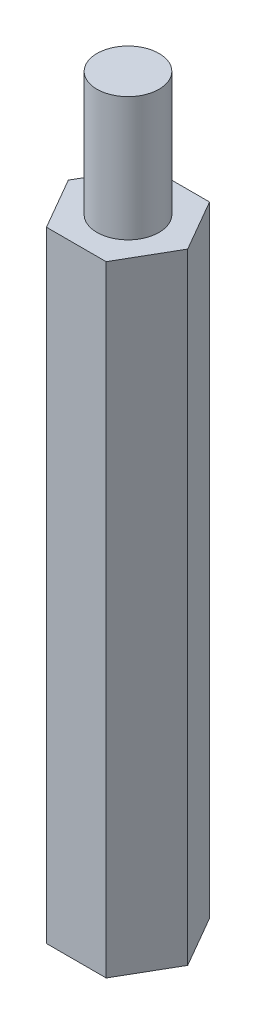
ISO-10303-21;
HEADER;
FILE_DESCRIPTION(('STEP AP214'),'2;1');
FILE_NAME('part.step','',(''),(''),'','','');
FILE_SCHEMA(('AUTOMOTIVE_DESIGN { 1 0 10303 214 1 1 1 1 }'));
ENDSEC;
DATA;
#1=APPLICATION_CONTEXT('core data for automotive mechanical design processes');
#2=APPLICATION_PROTOCOL_DEFINITION('international standard','automotive_design',2000,#1);
#3=PRODUCT_CONTEXT('',#1,'mechanical');
#4=PRODUCT('Part','Part','',(#3));
#5=PRODUCT_RELATED_PRODUCT_CATEGORY('part','',(#4));
#6=PRODUCT_DEFINITION_FORMATION('','',#4);
#7=PRODUCT_DEFINITION_CONTEXT('part definition',#1,'design');
#8=PRODUCT_DEFINITION('design','',#6,#7);
#9=PRODUCT_DEFINITION_SHAPE('','',#8);
#10=(LENGTH_UNIT() NAMED_UNIT(*) SI_UNIT(.MILLI.,.METRE.));
#11=(NAMED_UNIT(*) PLANE_ANGLE_UNIT() SI_UNIT($,.RADIAN.));
#12=(NAMED_UNIT(*) SI_UNIT($,.STERADIAN.) SOLID_ANGLE_UNIT());
#13=UNCERTAINTY_MEASURE_WITH_UNIT(LENGTH_MEASURE(1.E-05),#10,'distance_accuracy_value','');
#14=(GEOMETRIC_REPRESENTATION_CONTEXT(3) GLOBAL_UNCERTAINTY_ASSIGNED_CONTEXT((#13)) GLOBAL_UNIT_ASSIGNED_CONTEXT((#10,
#11,#12)) REPRESENTATION_CONTEXT('',''));
#15=CARTESIAN_POINT('',(0.,0.,0.));
#16=DIRECTION('',(0.,0.,1.));
#17=DIRECTION('',(1.,0.,0.));
#18=AXIS2_PLACEMENT_3D('',#15,#16,#17);
#19=CARTESIAN_POINT('',(1.44337567297406,15.,2.5));
#20=DIRECTION('',(-0.866025403784439,0.,-0.5));
#21=DIRECTION('',(-0.5,0.,0.866025403784439));
#22=AXIS2_PLACEMENT_3D('',#19,#20,#21);
#23=PLANE('',#22);
#24=DIRECTION('',(0.5,0.,-0.866025403784439));
#25=VECTOR('',#24,1.);
#26=CARTESIAN_POINT('',(1.44337567297406,-15.,2.5));
#27=LINE('',#26,#25);
#28=CARTESIAN_POINT('',(1.44337567297406,-15.,2.5));
#29=VERTEX_POINT('',#28);
#30=CARTESIAN_POINT('',(2.88675134594813,-15.,0.));
#31=VERTEX_POINT('',#30);
#32=EDGE_CURVE('E103',#29,#31,#27,.T.);
#33=ORIENTED_EDGE('',*,*,#32,.T.);
#34=DIRECTION('',(0.,-1.,0.));
#35=VECTOR('',#34,1.);
#36=CARTESIAN_POINT('',(2.88675134594813,15.,0.));
#37=LINE('',#36,#35);
#38=CARTESIAN_POINT('',(2.88675134594813,15.,0.));
#39=VERTEX_POINT('',#38);
#40=EDGE_CURVE('E20',#39,#31,#37,.T.);
#41=ORIENTED_EDGE('',*,*,#40,.F.);
#42=DIRECTION('',(0.5,0.,-0.866025403784439));
#43=VECTOR('',#42,1.);
#44=CARTESIAN_POINT('',(1.44337567297406,15.,2.5));
#45=LINE('',#44,#43);
#46=CARTESIAN_POINT('',(1.44337567297406,15.,2.5));
#47=VERTEX_POINT('',#46);
#48=EDGE_CURVE('E114',#47,#39,#45,.T.);
#49=ORIENTED_EDGE('',*,*,#48,.F.);
#50=DIRECTION('',(0.,-1.,0.));
#51=VECTOR('',#50,1.);
#52=CARTESIAN_POINT('',(1.44337567297406,15.,2.5));
#53=LINE('',#52,#51);
#54=EDGE_CURVE('E99',#47,#29,#53,.T.);
#55=ORIENTED_EDGE('',*,*,#54,.T.);
#56=EDGE_LOOP('',(#33,#41,#49,#55));
#57=FACE_BOUND('',#56,.T.);
#58=ADVANCED_FACE('F17',(#57),#23,.F.);
#59=CARTESIAN_POINT('',(2.88675134594813,15.,0.));
#60=DIRECTION('',(-0.866025403784439,0.,0.5));
#61=DIRECTION('',(0.5,0.,0.866025403784439));
#62=AXIS2_PLACEMENT_3D('',#59,#60,#61);
#63=PLANE('',#62);
#64=DIRECTION('',(-0.5,0.,-0.866025403784439));
#65=VECTOR('',#64,1.);
#66=CARTESIAN_POINT('',(2.88675134594813,-15.,0.));
#67=LINE('',#66,#65);
#68=CARTESIAN_POINT('',(1.44337567297406,-15.,-2.5));
#69=VERTEX_POINT('',#68);
#70=EDGE_CURVE('E106',#31,#69,#67,.T.);
#71=ORIENTED_EDGE('',*,*,#70,.T.);
#72=DIRECTION('',(0.,-1.,0.));
#73=VECTOR('',#72,1.);
#74=CARTESIAN_POINT('',(1.44337567297406,15.,-2.5));
#75=LINE('',#74,#73);
#76=CARTESIAN_POINT('',(1.44337567297406,15.,-2.5));
#77=VERTEX_POINT('',#76);
#78=EDGE_CURVE('E117',#77,#69,#75,.T.);
#79=ORIENTED_EDGE('',*,*,#78,.F.);
#80=DIRECTION('',(-0.5,0.,-0.866025403784439));
#81=VECTOR('',#80,1.);
#82=CARTESIAN_POINT('',(2.88675134594813,15.,0.));
#83=LINE('',#82,#81);
#84=EDGE_CURVE('E72',#39,#77,#83,.T.);
#85=ORIENTED_EDGE('',*,*,#84,.F.);
#86=ORIENTED_EDGE('',*,*,#40,.T.);
#87=EDGE_LOOP('',(#71,#79,#85,#86));
#88=FACE_BOUND('',#87,.T.);
#89=ADVANCED_FACE('F122',(#88),#63,.F.);
#90=CARTESIAN_POINT('',(1.44337567297406,15.,-2.5));
#91=DIRECTION('',(0.,0.,1.));
#92=DIRECTION('',(1.,0.,0.));
#93=AXIS2_PLACEMENT_3D('',#90,#91,#92);
#94=PLANE('',#93);
#95=DIRECTION('',(-1.,0.,0.));
#96=VECTOR('',#95,1.);
#97=CARTESIAN_POINT('',(1.44337567297406,-15.,-2.5));
#98=LINE('',#97,#96);
#99=CARTESIAN_POINT('',(-1.44337567297406,-15.,-2.5));
#100=VERTEX_POINT('',#99);
#101=EDGE_CURVE('E109',#69,#100,#98,.T.);
#102=ORIENTED_EDGE('',*,*,#101,.T.);
#103=DIRECTION('',(0.,-1.,0.));
#104=VECTOR('',#103,1.);
#105=CARTESIAN_POINT('',(-1.44337567297406,15.,-2.5));
#106=LINE('',#105,#104);
#107=CARTESIAN_POINT('',(-1.44337567297406,15.,-2.5));
#108=VERTEX_POINT('',#107);
#109=EDGE_CURVE('E94',#108,#100,#106,.T.);
#110=ORIENTED_EDGE('',*,*,#109,.F.);
#111=DIRECTION('',(-1.,0.,0.));
#112=VECTOR('',#111,1.);
#113=CARTESIAN_POINT('',(1.44337567297406,15.,-2.5));
#114=LINE('',#113,#112);
#115=EDGE_CURVE('E85',#77,#108,#114,.T.);
#116=ORIENTED_EDGE('',*,*,#115,.F.);
#117=ORIENTED_EDGE('',*,*,#78,.T.);
#118=EDGE_LOOP('',(#102,#110,#116,#117));
#119=FACE_BOUND('',#118,.T.);
#120=ADVANCED_FACE('F128',(#119),#94,.F.);
#121=CARTESIAN_POINT('',(-1.44337567297406,15.,-2.5));
#122=DIRECTION('',(0.866025403784438,0.,0.5));
#123=DIRECTION('',(0.5,0.,-0.866025403784439));
#124=AXIS2_PLACEMENT_3D('',#121,#122,#123);
#125=PLANE('',#124);
#126=DIRECTION('',(-0.5,0.,0.866025403784439));
#127=VECTOR('',#126,1.);
#128=CARTESIAN_POINT('',(-1.44337567297406,-15.,-2.5));
#129=LINE('',#128,#127);
#130=CARTESIAN_POINT('',(-2.88675134594813,-15.,0.));
#131=VERTEX_POINT('',#130);
#132=EDGE_CURVE('E93',#100,#131,#129,.T.);
#133=ORIENTED_EDGE('',*,*,#132,.T.);
#134=DIRECTION('',(0.,-1.,0.));
#135=VECTOR('',#134,1.);
#136=CARTESIAN_POINT('',(-2.88675134594813,15.,0.));
#137=LINE('',#136,#135);
#138=CARTESIAN_POINT('',(-2.88675134594813,15.,0.));
#139=VERTEX_POINT('',#138);
#140=EDGE_CURVE('E90',#139,#131,#137,.T.);
#141=ORIENTED_EDGE('',*,*,#140,.F.);
#142=DIRECTION('',(-0.5,0.,0.866025403784439));
#143=VECTOR('',#142,1.);
#144=CARTESIAN_POINT('',(-1.44337567297406,15.,-2.5));
#145=LINE('',#144,#143);
#146=EDGE_CURVE('E79',#108,#139,#145,.T.);
#147=ORIENTED_EDGE('',*,*,#146,.F.);
#148=ORIENTED_EDGE('',*,*,#109,.T.);
#149=EDGE_LOOP('',(#133,#141,#147,#148));
#150=FACE_BOUND('',#149,.T.);
#151=ADVANCED_FACE('F91',(#150),#125,.F.);
#152=CARTESIAN_POINT('',(-2.88675134594813,15.,0.));
#153=DIRECTION('',(0.866025403784439,0.,-0.5));
#154=DIRECTION('',(-0.5,0.,-0.866025403784439));
#155=AXIS2_PLACEMENT_3D('',#152,#153,#154);
#156=PLANE('',#155);
#157=DIRECTION('',(0.5,0.,0.866025403784439));
#158=VECTOR('',#157,1.);
#159=CARTESIAN_POINT('',(-2.88675134594813,-15.,0.));
#160=LINE('',#159,#158);
#161=CARTESIAN_POINT('',(-1.44337567297406,-15.,2.5));
#162=VERTEX_POINT('',#161);
#163=EDGE_CURVE('E57',#131,#162,#160,.T.);
#164=ORIENTED_EDGE('',*,*,#163,.T.);
#165=DIRECTION('',(0.,-1.,0.));
#166=VECTOR('',#165,1.);
#167=CARTESIAN_POINT('',(-1.44337567297406,15.,2.5));
#168=LINE('',#167,#166);
#169=CARTESIAN_POINT('',(-1.44337567297406,15.,2.5));
#170=VERTEX_POINT('',#169);
#171=EDGE_CURVE('E95',#170,#162,#168,.T.);
#172=ORIENTED_EDGE('',*,*,#171,.F.);
#173=DIRECTION('',(0.5,0.,0.866025403784439));
#174=VECTOR('',#173,1.);
#175=CARTESIAN_POINT('',(-2.88675134594813,15.,0.));
#176=LINE('',#175,#174);
#177=EDGE_CURVE('E83',#139,#170,#176,.T.);
#178=ORIENTED_EDGE('',*,*,#177,.F.);
#179=ORIENTED_EDGE('',*,*,#140,.T.);
#180=EDGE_LOOP('',(#164,#172,#178,#179));
#181=FACE_BOUND('',#180,.T.);
#182=ADVANCED_FACE('F97',(#181),#156,.F.);
#183=CARTESIAN_POINT('',(-1.44337567297406,15.,2.5));
#184=DIRECTION('',(0.,0.,-1.));
#185=DIRECTION('',(-1.,0.,0.));
#186=AXIS2_PLACEMENT_3D('',#183,#184,#185);
#187=PLANE('',#186);
#188=DIRECTION('',(1.,0.,0.));
#189=VECTOR('',#188,1.);
#190=CARTESIAN_POINT('',(-1.44337567297406,-15.,2.5));
#191=LINE('',#190,#189);
#192=EDGE_CURVE('E63',#162,#29,#191,.T.);
#193=ORIENTED_EDGE('',*,*,#192,.T.);
#194=ORIENTED_EDGE('',*,*,#54,.F.);
#195=DIRECTION('',(1.,0.,0.));
#196=VECTOR('',#195,1.);
#197=CARTESIAN_POINT('',(-1.44337567297406,15.,2.5));
#198=LINE('',#197,#196);
#199=EDGE_CURVE('E34',#170,#47,#198,.T.);
#200=ORIENTED_EDGE('',*,*,#199,.F.);
#201=ORIENTED_EDGE('',*,*,#171,.T.);
#202=EDGE_LOOP('',(#193,#194,#200,#201));
#203=FACE_BOUND('',#202,.T.);
#204=ADVANCED_FACE('F151',(#203),#187,.F.);
#205=CARTESIAN_POINT('',(0.,15.,0.));
#206=DIRECTION('',(0.,1.,0.));
#207=DIRECTION('',(0.,0.,1.));
#208=AXIS2_PLACEMENT_3D('',#205,#206,#207);
#209=PLANE('',#208);
#210=CARTESIAN_POINT('',(0.,15.,0.));
#211=DIRECTION('',(0.,1.,0.));
#212=DIRECTION('',(0.,0.,1.));
#213=AXIS2_PLACEMENT_3D('',#210,#211,#212);
#214=CIRCLE('',#213,1.5);
#215=CARTESIAN_POINT('',(0.,15.,1.5));
#216=VERTEX_POINT('',#215);
#217=EDGE_CURVE('E11',#216,#216,#214,.T.);
#218=ORIENTED_EDGE('',*,*,#217,.F.);
#219=EDGE_LOOP('',(#218));
#220=FACE_BOUND('',#219,.T.);
#221=ORIENTED_EDGE('',*,*,#48,.T.);
#222=ORIENTED_EDGE('',*,*,#84,.T.);
#223=ORIENTED_EDGE('',*,*,#115,.T.);
#224=ORIENTED_EDGE('',*,*,#146,.T.);
#225=ORIENTED_EDGE('',*,*,#177,.T.);
#226=ORIENTED_EDGE('',*,*,#199,.T.);
#227=EDGE_LOOP('',(#221,#222,#223,#224,#225,#226));
#228=FACE_BOUND('',#227,.T.);
#229=ADVANCED_FACE('F81',(#220,#228),#209,.T.);
#230=CARTESIAN_POINT('',(0.,-15.,0.));
#231=DIRECTION('',(0.,1.,0.));
#232=DIRECTION('',(0.,0.,1.));
#233=AXIS2_PLACEMENT_3D('',#230,#231,#232);
#234=PLANE('',#233);
#235=CARTESIAN_POINT('',(0.,-15.,0.));
#236=DIRECTION('',(0.,-1.,0.));
#237=DIRECTION('',(0.,0.,-1.));
#238=AXIS2_PLACEMENT_3D('',#235,#236,#237);
#239=CIRCLE('',#238,1.5);
#240=CARTESIAN_POINT('',(0.,-15.,-1.5));
#241=VERTEX_POINT('',#240);
#242=EDGE_CURVE('E132',#241,#241,#239,.T.);
#243=ORIENTED_EDGE('',*,*,#242,.F.);
#244=EDGE_LOOP('',(#243));
#245=FACE_BOUND('',#244,.T.);
#246=ORIENTED_EDGE('',*,*,#32,.F.);
#247=ORIENTED_EDGE('',*,*,#192,.F.);
#248=ORIENTED_EDGE('',*,*,#163,.F.);
#249=ORIENTED_EDGE('',*,*,#132,.F.);
#250=ORIENTED_EDGE('',*,*,#101,.F.);
#251=ORIENTED_EDGE('',*,*,#70,.F.);
#252=EDGE_LOOP('',(#246,#247,#248,#249,#250,#251));
#253=FACE_BOUND('',#252,.T.);
#254=ADVANCED_FACE('F127',(#245,#253),#234,.F.);
#255=CARTESIAN_POINT('',(0.,-7.,0.));
#256=DIRECTION('',(0.,-1.,0.));
#257=DIRECTION('',(0.,0.,-1.));
#258=AXIS2_PLACEMENT_3D('',#255,#256,#257);
#259=CYLINDRICAL_SURFACE('',#258,1.5);
#260=CARTESIAN_POINT('',(0.,-7.,0.));
#261=DIRECTION('',(0.,-1.,0.));
#262=DIRECTION('',(0.,0.,-1.));
#263=AXIS2_PLACEMENT_3D('',#260,#261,#262);
#264=CIRCLE('',#263,1.5);
#265=CARTESIAN_POINT('',(0.,-7.,-1.5));
#266=VERTEX_POINT('',#265);
#267=EDGE_CURVE('E107',#266,#266,#264,.T.);
#268=ORIENTED_EDGE('',*,*,#267,.F.);
#269=EDGE_LOOP('',(#268));
#270=FACE_BOUND('',#269,.T.);
#271=ORIENTED_EDGE('',*,*,#242,.T.);
#272=EDGE_LOOP('',(#271));
#273=FACE_BOUND('',#272,.T.);
#274=ADVANCED_FACE('F159',(#270,#273),#259,.F.);
#275=CARTESIAN_POINT('',(0.,-7.,0.));
#276=DIRECTION('',(0.,-1.,0.));
#277=DIRECTION('',(0.,0.,-1.));
#278=AXIS2_PLACEMENT_3D('',#275,#276,#277);
#279=PLANE('',#278);
#280=ORIENTED_EDGE('',*,*,#267,.T.);
#281=EDGE_LOOP('',(#280));
#282=FACE_BOUND('',#281,.T.);
#283=ADVANCED_FACE('F146',(#282),#279,.T.);
#284=CARTESIAN_POINT('',(0.,21.,0.));
#285=DIRECTION('',(0.,-1.,0.));
#286=DIRECTION('',(0.,0.,-1.));
#287=AXIS2_PLACEMENT_3D('',#284,#285,#286);
#288=CYLINDRICAL_SURFACE('',#287,1.5);
#289=CARTESIAN_POINT('',(0.,21.,0.));
#290=DIRECTION('',(0.,1.,0.));
#291=DIRECTION('',(0.,0.,1.));
#292=AXIS2_PLACEMENT_3D('',#289,#290,#291);
#293=CIRCLE('',#292,1.5);
#294=CARTESIAN_POINT('',(0.,21.,1.5));
#295=VERTEX_POINT('',#294);
#296=EDGE_CURVE('E135',#295,#295,#293,.T.);
#297=ORIENTED_EDGE('',*,*,#296,.F.);
#298=EDGE_LOOP('',(#297));
#299=FACE_BOUND('',#298,.T.);
#300=ORIENTED_EDGE('',*,*,#217,.T.);
#301=EDGE_LOOP('',(#300));
#302=FACE_BOUND('',#301,.T.);
#303=ADVANCED_FACE('F143',(#299,#302),#288,.T.);
#304=CARTESIAN_POINT('',(0.,21.,0.));
#305=DIRECTION('',(0.,1.,0.));
#306=DIRECTION('',(0.,0.,1.));
#307=AXIS2_PLACEMENT_3D('',#304,#305,#306);
#308=PLANE('',#307);
#309=ORIENTED_EDGE('',*,*,#296,.T.);
#310=EDGE_LOOP('',(#309));
#311=FACE_BOUND('',#310,.T.);
#312=ADVANCED_FACE('F141',(#311),#308,.T.);
#313=CLOSED_SHELL('',(#58,#89,#120,#151,#182,#204,#229,#254,#274,#283,#303,#312));
#314=MANIFOLD_SOLID_BREP('B1',#313);
#315=ADVANCED_BREP_SHAPE_REPRESENTATION('',(#18,#314),#14);
#316=SHAPE_DEFINITION_REPRESENTATION(#9,#315);
ENDSEC;
END-ISO-10303-21;
